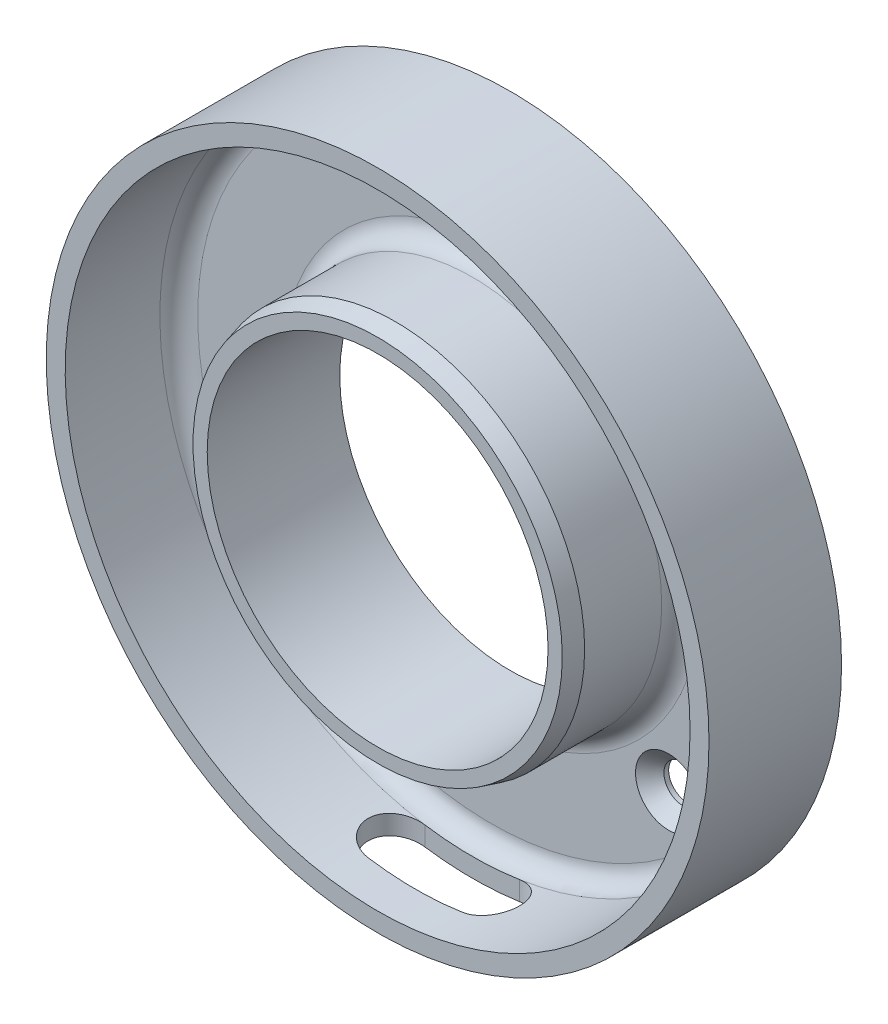
ISO-10303-21;
HEADER;
FILE_DESCRIPTION(('STEP AP214'),'2;1');
FILE_NAME('part.step','',(''),(''),'','','');
FILE_SCHEMA(('AUTOMOTIVE_DESIGN { 1 0 10303 214 1 1 1 1 }'));
ENDSEC;
DATA;
#1=APPLICATION_CONTEXT('core data for automotive mechanical design processes');
#2=APPLICATION_PROTOCOL_DEFINITION('international standard','automotive_design',2000,#1);
#3=PRODUCT_CONTEXT('',#1,'mechanical');
#4=PRODUCT('Part','Part','',(#3));
#5=PRODUCT_RELATED_PRODUCT_CATEGORY('part','',(#4));
#6=PRODUCT_DEFINITION_FORMATION('','',#4);
#7=PRODUCT_DEFINITION_CONTEXT('part definition',#1,'design');
#8=PRODUCT_DEFINITION('design','',#6,#7);
#9=PRODUCT_DEFINITION_SHAPE('','',#8);
#10=(LENGTH_UNIT() NAMED_UNIT(*) SI_UNIT(.MILLI.,.METRE.));
#11=(NAMED_UNIT(*) PLANE_ANGLE_UNIT() SI_UNIT($,.RADIAN.));
#12=(NAMED_UNIT(*) SI_UNIT($,.STERADIAN.) SOLID_ANGLE_UNIT());
#13=UNCERTAINTY_MEASURE_WITH_UNIT(LENGTH_MEASURE(1.E-05),#10,'distance_accuracy_value','');
#14=(GEOMETRIC_REPRESENTATION_CONTEXT(3) GLOBAL_UNCERTAINTY_ASSIGNED_CONTEXT((#13)) GLOBAL_UNIT_ASSIGNED_CONTEXT((#10,
#11,#12)) REPRESENTATION_CONTEXT('',''));
#15=CARTESIAN_POINT('',(0.,0.,0.));
#16=DIRECTION('',(0.,0.,1.));
#17=DIRECTION('',(1.,0.,0.));
#18=AXIS2_PLACEMENT_3D('',#15,#16,#17);
#19=CARTESIAN_POINT('',(0.,0.,14.));
#20=DIRECTION('',(0.,0.,1.));
#21=DIRECTION('',(1.,0.,0.));
#22=AXIS2_PLACEMENT_3D('',#19,#20,#21);
#23=PLANE('',#22);
#24=CARTESIAN_POINT('',(0.,0.,14.));
#25=DIRECTION('',(0.,0.,1.));
#26=DIRECTION('',(1.,0.,0.));
#27=AXIS2_PLACEMENT_3D('',#24,#25,#26);
#28=CIRCLE('',#27,19.5);
#29=CARTESIAN_POINT('',(19.5,0.,14.));
#30=VERTEX_POINT('',#29);
#31=EDGE_CURVE('E41',#30,#30,#28,.T.);
#32=ORIENTED_EDGE('',*,*,#31,.T.);
#33=EDGE_LOOP('',(#32));
#34=FACE_BOUND('',#33,.T.);
#35=CARTESIAN_POINT('',(0.,0.,14.));
#36=DIRECTION('',(0.,0.,1.));
#37=DIRECTION('',(1.,0.,0.));
#38=AXIS2_PLACEMENT_3D('',#35,#36,#37);
#39=CIRCLE('',#38,18.);
#40=CARTESIAN_POINT('',(18.,0.,14.));
#41=VERTEX_POINT('',#40);
#42=EDGE_CURVE('E303',#41,#41,#39,.T.);
#43=ORIENTED_EDGE('',*,*,#42,.F.);
#44=EDGE_LOOP('',(#43));
#45=FACE_BOUND('',#44,.T.);
#46=ADVANCED_FACE('F33',(#34,#45),#23,.T.);
#47=CARTESIAN_POINT('',(0.,0.,14.));
#48=DIRECTION('',(0.,0.,-1.));
#49=DIRECTION('',(-1.,0.,0.));
#50=AXIS2_PLACEMENT_3D('',#47,#48,#49);
#51=CYLINDRICAL_SURFACE('',#50,35.);
#52=CARTESIAN_POINT('',(-5.,-34.6410161513776,4.));
#53=CARTESIAN_POINT('',(-5.08552983660781,-34.6286741180472,3.99999232107327));
#54=CARTESIAN_POINT('',(-5.17100720663486,-34.6160100937747,4.00365760441739));
#55=CARTESIAN_POINT('',(-5.34125080407917,-34.5901488194821,4.01824974552053));
#56=CARTESIAN_POINT('',(-5.42601709726176,-34.5769516194454,4.02917592407328));
#57=CARTESIAN_POINT('',(-5.59418606042166,-34.5501423628034,4.05819475155788));
#58=CARTESIAN_POINT('',(-5.67758969671915,-34.5365306217022,4.07628207009953));
#59=CARTESIAN_POINT('',(-5.84248929187043,-34.5090179683182,4.11946432857444));
#60=CARTESIAN_POINT('',(-5.92398524564424,-34.4951170552656,4.14455928716612));
#61=CARTESIAN_POINT('',(-6.16480132889005,-34.4531806222849,4.23012638405849));
#62=CARTESIAN_POINT('',(-6.32055894059739,-34.4248938764362,4.30089972848106));
#63=CARTESIAN_POINT('',(-6.61780909883044,-34.3689912628606,4.46784867583562));
#64=CARTESIAN_POINT('',(-6.75930307970359,-34.3413753278894,4.56402172105168));
#65=CARTESIAN_POINT('',(-7.02448652539232,-34.288116468765,4.77948428739878));
#66=CARTESIAN_POINT('',(-7.14813300530283,-34.2624783750169,4.89882804634267));
#67=CARTESIAN_POINT('',(-7.37355290099156,-34.2146757601151,5.15727076763862));
#68=CARTESIAN_POINT('',(-7.47532507548347,-34.1925114361044,5.29637085034584));
#69=CARTESIAN_POINT('',(-7.65264057717463,-34.1532613360815,5.58850901656804));
#70=CARTESIAN_POINT('',(-7.72851108576975,-34.136112634544,5.74133985839494));
#71=CARTESIAN_POINT('',(-7.853384158209,-34.1076016596265,6.05810441855108));
#72=CARTESIAN_POINT('',(-7.90239238011742,-34.0962381677306,6.22203579057101));
#73=CARTESIAN_POINT('',(-7.97106578840376,-34.080248438695,6.55219703013407));
#74=CARTESIAN_POINT('',(-7.99139662382684,-34.0754694283428,6.71828118319439));
#75=CARTESIAN_POINT('',(-8.00418785175352,-34.0724672782652,7.05157365129391));
#76=CARTESIAN_POINT('',(-7.99665053965215,-34.0742435986018,7.21878187261546));
#77=CARTESIAN_POINT('',(-7.95427353884131,-34.0841602970762,7.54705631147333));
#78=CARTESIAN_POINT('',(-7.9198259614072,-34.0922092719164,7.70817617446399));
#79=CARTESIAN_POINT('',(-7.82522215842988,-34.1140474773401,8.02226368318522));
#80=CARTESIAN_POINT('',(-7.76506521948651,-34.1278368672122,8.17523110256397));
#81=CARTESIAN_POINT('',(-7.62032515732691,-34.1604473612357,8.4700613590119));
#82=CARTESIAN_POINT('',(-7.53555222198686,-34.1793074782977,8.61182657766984));
#83=CARTESIAN_POINT('',(-7.34428078798582,-34.220915983508,8.87919473359257));
#84=CARTESIAN_POINT('',(-7.23778086568783,-34.2436646264316,9.00479661089221));
#85=CARTESIAN_POINT('',(-7.00340731002443,-34.2923738138387,9.23929769189263));
#86=CARTESIAN_POINT('',(-6.87510667280867,-34.31839511105,9.34775748474168));
#87=CARTESIAN_POINT('',(-6.60238733421846,-34.3719037328589,9.5417246385616));
#88=CARTESIAN_POINT('',(-6.45796169398025,-34.3993916859065,9.62722206412283));
#89=CARTESIAN_POINT('',(-6.15406732177771,-34.4550688267875,9.7743809643749));
#90=CARTESIAN_POINT('',(-5.99436378459923,-34.4832613740871,9.83555549804539));
#91=CARTESIAN_POINT('',(-5.66685808908223,-34.538589548491,9.92988829311847));
#92=CARTESIAN_POINT('',(-5.49906875058232,-34.5657267329133,9.96308945474826));
#93=CARTESIAN_POINT('',(-5.27498719812142,-34.6002546459527,9.98788122555558));
#94=CARTESIAN_POINT('',(-5.22006585037706,-34.6085830624529,9.99242651462529));
#95=CARTESIAN_POINT('',(-5.11011018567253,-34.6249887298404,9.99848191580185));
#96=CARTESIAN_POINT('',(-5.05507619737736,-34.6330663669283,9.99999694872525));
#97=CARTESIAN_POINT('',(-5.,-34.6410161513776,10.));
#98=B_SPLINE_CURVE_WITH_KNOTS('',3,(#52,#53,#54,#55,#56,#57,#58,#59,#60,#61,#62,#63,#64,#65,#66,
#67,#68,#69,#70,#71,#72,#73,#74,#75,#76,#77,#78,#79,#80,#81,#82,#83,#84,#85,#86,#87,#88,#89,#90,
#91,#92,#93,#94,#95,#96,#97),.UNSPECIFIED.,.F.,.F.,(4,2,2,2,2,2,2,2,2,2,2,2,2,2,2,2,2,2,2,2,2,2,
4),(0.,0.259158900700492,0.518293562299219,0.777235698716151,1.03617852459403,1.55373157397357,
2.071232526311,2.58995977228071,3.10871644634519,3.62065431684983,4.13248431524317,
4.63222662278304,5.13192776933623,5.62448053854274,6.11704697631278,6.61351727186552,
7.11002010854431,7.61769458654408,8.12558837370307,8.64319200270672,9.1600003774872,
9.32714537982392,9.49401873520856),.UNSPECIFIED.);
#99=CARTESIAN_POINT('',(-5.,-34.6410161513775,4.));
#100=VERTEX_POINT('',#99);
#101=CARTESIAN_POINT('',(-5.,-34.6410161513775,10.));
#102=VERTEX_POINT('',#101);
#103=EDGE_CURVE('E232',#100,#102,#98,.T.);
#104=ORIENTED_EDGE('',*,*,#103,.T.);
#105=CARTESIAN_POINT('',(0.,0.,10.));
#106=DIRECTION('',(0.,0.,1.));
#107=DIRECTION('',(1.,0.,0.));
#108=AXIS2_PLACEMENT_3D('',#105,#106,#107);
#109=CIRCLE('',#108,35.);
#110=CARTESIAN_POINT('',(5.,-34.6410161513775,10.));
#111=VERTEX_POINT('',#110);
#112=EDGE_CURVE('E238',#102,#111,#109,.T.);
#113=ORIENTED_EDGE('',*,*,#112,.T.);
#114=CARTESIAN_POINT('',(5.,-34.6410161513776,10.));
#115=CARTESIAN_POINT('',(5.08552983660781,-34.6286741180472,10.0000076789267));
#116=CARTESIAN_POINT('',(5.17100720663486,-34.6160100937747,9.99634239558261));
#117=CARTESIAN_POINT('',(5.34125080407917,-34.5901488194821,9.98175025447947));
#118=CARTESIAN_POINT('',(5.42601709726177,-34.5769516194454,9.97082407592672));
#119=CARTESIAN_POINT('',(5.59418606042166,-34.5501423628034,9.94180524844212));
#120=CARTESIAN_POINT('',(5.67758969671915,-34.5365306217022,9.92371792990047));
#121=CARTESIAN_POINT('',(5.84248929187043,-34.5090179683182,9.88053567142556));
#122=CARTESIAN_POINT('',(5.92398524564424,-34.4951170552656,9.85544071283388));
#123=CARTESIAN_POINT('',(6.16480132889005,-34.4531806222849,9.76987361594151));
#124=CARTESIAN_POINT('',(6.32055894059739,-34.4248938764362,9.69910027151894));
#125=CARTESIAN_POINT('',(6.61780909883044,-34.3689912628606,9.53215132416438));
#126=CARTESIAN_POINT('',(6.75930307970359,-34.3413753278894,9.43597827894832));
#127=CARTESIAN_POINT('',(7.02448652539232,-34.288116468765,9.22051571260122));
#128=CARTESIAN_POINT('',(7.14813300530283,-34.2624783750169,9.10117195365733));
#129=CARTESIAN_POINT('',(7.37355290099156,-34.2146757601151,8.84272923236138));
#130=CARTESIAN_POINT('',(7.47532507548347,-34.1925114361044,8.70362914965416));
#131=CARTESIAN_POINT('',(7.65264057717463,-34.1532613360815,8.41149098343196));
#132=CARTESIAN_POINT('',(7.72851108576975,-34.136112634544,8.25866014160506));
#133=CARTESIAN_POINT('',(7.853384158209,-34.1076016596265,7.94189558144892));
#134=CARTESIAN_POINT('',(7.90239238011742,-34.0962381677306,7.77796420942898));
#135=CARTESIAN_POINT('',(7.97106578840376,-34.080248438695,7.44780296986593));
#136=CARTESIAN_POINT('',(7.99139662382684,-34.0754694283428,7.28171881680561));
#137=CARTESIAN_POINT('',(8.00418785175352,-34.0724672782652,6.94842634870609));
#138=CARTESIAN_POINT('',(7.99665053965215,-34.0742435986018,6.78121812738454));
#139=CARTESIAN_POINT('',(7.95427353884131,-34.0841602970762,6.45294368852667));
#140=CARTESIAN_POINT('',(7.91982596140721,-34.0922092719164,6.29182382553601));
#141=CARTESIAN_POINT('',(7.82522215842989,-34.1140474773401,5.97773631681478));
#142=CARTESIAN_POINT('',(7.76506521948651,-34.1278368672122,5.82476889743603));
#143=CARTESIAN_POINT('',(7.62032515732691,-34.1604473612357,5.5299386409881));
#144=CARTESIAN_POINT('',(7.53555222198686,-34.1793074782977,5.38817342233016));
#145=CARTESIAN_POINT('',(7.34428078798582,-34.220915983508,5.12080526640743));
#146=CARTESIAN_POINT('',(7.23778086568783,-34.2436646264316,4.99520338910779));
#147=CARTESIAN_POINT('',(7.00340731002443,-34.2923738138387,4.76070230810737));
#148=CARTESIAN_POINT('',(6.87510667280867,-34.31839511105,4.65224251525832));
#149=CARTESIAN_POINT('',(6.60238733421846,-34.3719037328589,4.4582753614384));
#150=CARTESIAN_POINT('',(6.45796169398025,-34.3993916859065,4.37277793587716));
#151=CARTESIAN_POINT('',(6.15406732177771,-34.4550688267875,4.2256190356251));
#152=CARTESIAN_POINT('',(5.99436378459923,-34.4832613740871,4.1644445019546));
#153=CARTESIAN_POINT('',(5.66685808908223,-34.538589548491,4.07011170688153));
#154=CARTESIAN_POINT('',(5.49906875058232,-34.5657267329133,4.03691054525174));
#155=CARTESIAN_POINT('',(5.27498719812142,-34.6002546459527,4.01211877444442));
#156=CARTESIAN_POINT('',(5.22006585037706,-34.6085830624529,4.00757348537471));
#157=CARTESIAN_POINT('',(5.11011018567253,-34.6249887298404,4.00151808419815));
#158=CARTESIAN_POINT('',(5.05507619737736,-34.6330663669283,4.00000305127475));
#159=CARTESIAN_POINT('',(5.,-34.6410161513776,4.));
#160=B_SPLINE_CURVE_WITH_KNOTS('',3,(#114,#115,#116,#117,#118,#119,#120,#121,#122,#123,#124,
#125,#126,#127,#128,#129,#130,#131,#132,#133,#134,#135,#136,#137,#138,#139,#140,#141,#142,#143,
#144,#145,#146,#147,#148,#149,#150,#151,#152,#153,#154,#155,#156,#157,#158,#159),.UNSPECIFIED.,
.F.,.F.,(4,2,2,2,2,2,2,2,2,2,2,2,2,2,2,2,2,2,2,2,2,2,4),(0.,0.259158900700492,0.518293562299219,
0.777235698716151,1.03617852459403,1.55373157397357,2.071232526311,2.58995977228071,
3.10871644634519,3.62065431684983,4.13248431524317,4.63222662278304,5.13192776933623,
5.62448053854274,6.11704697631278,6.61351727186552,7.11002010854431,7.61769458654408,
8.12558837370307,8.64319200270672,9.1600003774872,9.32714537982392,9.49401873520857),.UNSPECIFIED.);
#161=CARTESIAN_POINT('',(5.,-34.6410161513776,4.));
#162=VERTEX_POINT('',#161);
#163=EDGE_CURVE('E198',#111,#162,#160,.T.);
#164=ORIENTED_EDGE('',*,*,#163,.T.);
#165=CARTESIAN_POINT('',(0.,0.,4.));
#166=DIRECTION('',(0.,0.,-1.));
#167=DIRECTION('',(-1.,0.,0.));
#168=AXIS2_PLACEMENT_3D('',#165,#166,#167);
#169=CIRCLE('',#168,35.);
#170=EDGE_CURVE('E547',#162,#100,#169,.T.);
#171=ORIENTED_EDGE('',*,*,#170,.T.);
#172=EDGE_LOOP('',(#104,#113,#164,#171));
#173=FACE_BOUND('',#172,.T.);
#174=CARTESIAN_POINT('',(0.,0.,14.));
#175=DIRECTION('',(0.,0.,1.));
#176=DIRECTION('',(1.,0.,0.));
#177=AXIS2_PLACEMENT_3D('',#174,#175,#176);
#178=CIRCLE('',#177,35.);
#179=CARTESIAN_POINT('',(35.,0.,14.));
#180=VERTEX_POINT('',#179);
#181=EDGE_CURVE('E291',#180,#180,#178,.T.);
#182=ORIENTED_EDGE('',*,*,#181,.F.);
#183=EDGE_LOOP('',(#182));
#184=FACE_BOUND('',#183,.T.);
#185=CARTESIAN_POINT('',(0.,0.,0.));
#186=DIRECTION('',(0.,0.,1.));
#187=DIRECTION('',(1.,0.,0.));
#188=AXIS2_PLACEMENT_3D('',#185,#186,#187);
#189=CIRCLE('',#188,35.);
#190=CARTESIAN_POINT('',(35.,0.,0.));
#191=VERTEX_POINT('',#190);
#192=EDGE_CURVE('E294',#191,#191,#189,.T.);
#193=ORIENTED_EDGE('',*,*,#192,.T.);
#194=EDGE_LOOP('',(#193));
#195=FACE_BOUND('',#194,.T.);
#196=ADVANCED_FACE('F240',(#173,#184,#195),#51,.T.);
#197=CARTESIAN_POINT('',(0.,0.,14.));
#198=DIRECTION('',(0.,0.,1.));
#199=DIRECTION('',(1.,0.,0.));
#200=AXIS2_PLACEMENT_3D('',#197,#198,#199);
#201=CIRCLE('',#200,33.);
#202=CARTESIAN_POINT('',(33.,0.,14.));
#203=VERTEX_POINT('',#202);
#204=EDGE_CURVE('E288',#203,#203,#201,.T.);
#205=ORIENTED_EDGE('',*,*,#204,.F.);
#206=EDGE_LOOP('',(#205));
#207=FACE_BOUND('',#206,.T.);
#208=ORIENTED_EDGE('',*,*,#181,.T.);
#209=EDGE_LOOP('',(#208));
#210=FACE_BOUND('',#209,.T.);
#211=ADVANCED_FACE('F245',(#207,#210),#23,.T.);
#212=CARTESIAN_POINT('',(0.,0.,0.));
#213=DIRECTION('',(0.,0.,1.));
#214=DIRECTION('',(1.,0.,0.));
#215=AXIS2_PLACEMENT_3D('',#212,#213,#214);
#216=PLANE('',#215);
#217=CARTESIAN_POINT('',(18.7383297014435,-18.7383297014435,0.));
#218=DIRECTION('',(0.,0.,1.));
#219=DIRECTION('',(1.,0.,0.));
#220=AXIS2_PLACEMENT_3D('',#217,#218,#219);
#221=CIRCLE('',#220,2.);
#222=CARTESIAN_POINT('',(20.7383297014436,-18.7383297014435,0.));
#223=VERTEX_POINT('',#222);
#224=EDGE_CURVE('E338',#223,#223,#221,.T.);
#225=ORIENTED_EDGE('',*,*,#224,.T.);
#226=EDGE_LOOP('',(#225));
#227=FACE_BOUND('',#226,.T.);
#228=CARTESIAN_POINT('',(-18.7383297014435,-18.7383297014435,0.));
#229=DIRECTION('',(0.,0.,1.));
#230=DIRECTION('',(1.,0.,0.));
#231=AXIS2_PLACEMENT_3D('',#228,#229,#230);
#232=CIRCLE('',#231,2.);
#233=CARTESIAN_POINT('',(-16.7383297014435,-18.7383297014435,0.));
#234=VERTEX_POINT('',#233);
#235=EDGE_CURVE('E141',#234,#234,#232,.T.);
#236=ORIENTED_EDGE('',*,*,#235,.T.);
#237=EDGE_LOOP('',(#236));
#238=FACE_BOUND('',#237,.T.);
#239=DIRECTION('',(0.87681240867132,-0.480832611206851,0.));
#240=VECTOR('',#239,1.);
#241=CARTESIAN_POINT('',(-10.0217776156208,-28.0651460949938,0.));
#242=LINE('',#241,#240);
#243=CARTESIAN_POINT('',(-10.0217776156208,-28.0651460949938,0.));
#244=VERTEX_POINT('',#243);
#245=CARTESIAN_POINT('',(-8.63826259094278,-28.8238478827204,0.));
#246=VERTEX_POINT('',#245);
#247=EDGE_CURVE('E124',#244,#246,#242,.T.);
#248=ORIENTED_EDGE('',*,*,#247,.T.);
#249=DIRECTION('',(0.480832611206851,0.87681240867132,0.));
#250=VECTOR('',#249,1.);
#251=CARTESIAN_POINT('',(-8.63826259094278,-28.8238478827204,0.));
#252=LINE('',#251,#250);
#253=CARTESIAN_POINT('',(-8.11559739232955,-27.8707525205434,0.));
#254=VERTEX_POINT('',#253);
#255=EDGE_CURVE('E118',#246,#254,#252,.T.);
#256=ORIENTED_EDGE('',*,*,#255,.T.);
#257=DIRECTION('',(-0.87681240867132,0.48083261120685,0.));
#258=VECTOR('',#257,1.);
#259=CARTESIAN_POINT('',(-8.11559739232955,-27.8707525205434,0.));
#260=LINE('',#259,#258);
#261=CARTESIAN_POINT('',(-9.49911241700757,-27.1120507328167,0.));
#262=VERTEX_POINT('',#261);
#263=EDGE_CURVE('E127',#254,#262,#260,.T.);
#264=ORIENTED_EDGE('',*,*,#263,.T.);
#265=DIRECTION('',(0.48083261120685,0.87681240867132,0.));
#266=VECTOR('',#265,1.);
#267=CARTESIAN_POINT('',(-9.49911241700757,-27.1120507328167,0.));
#268=LINE('',#267,#266);
#269=CARTESIAN_POINT('',(-9.05906538012611,-26.3096120185035,0.));
#270=VERTEX_POINT('',#269);
#271=EDGE_CURVE('E48',#262,#270,#268,.T.);
#272=ORIENTED_EDGE('',*,*,#271,.T.);
#273=DIRECTION('',(-0.959999999999998,-0.280000000000007,0.));
#274=VECTOR('',#273,1.);
#275=CARTESIAN_POINT('',(-9.05906538012611,-26.3096120185035,0.));
#276=LINE('',#275,#274);
#277=CARTESIAN_POINT('',(-10.9844898511154,-26.8711941558754,0.));
#278=VERTEX_POINT('',#277);
#279=EDGE_CURVE('E145',#270,#278,#276,.T.);
#280=ORIENTED_EDGE('',*,*,#279,.T.);
#281=DIRECTION('',(0.280000000000008,-0.959999999999998,0.));
#282=VECTOR('',#281,1.);
#283=CARTESIAN_POINT('',(-10.9844898511154,-26.8711941558754,0.));
#284=LINE('',#283,#282);
#285=CARTESIAN_POINT('',(-10.4229077137435,-28.7966186268647,0.));
#286=VERTEX_POINT('',#285);
#287=EDGE_CURVE('E148',#278,#286,#284,.T.);
#288=ORIENTED_EDGE('',*,*,#287,.T.);
#289=DIRECTION('',(0.480832611206851,0.87681240867132,0.));
#290=VECTOR('',#289,1.);
#291=CARTESIAN_POINT('',(-10.4229077137435,-28.7966186268647,0.));
#292=LINE('',#291,#290);
#293=EDGE_CURVE('E151',#286,#244,#292,.T.);
#294=ORIENTED_EDGE('',*,*,#293,.T.);
#295=EDGE_LOOP('',(#248,#256,#264,#272,#280,#288,#294));
#296=FACE_BOUND('',#295,.T.);
#297=CARTESIAN_POINT('',(0.,0.,0.));
#298=DIRECTION('',(0.,0.,1.));
#299=DIRECTION('',(1.,0.,0.));
#300=AXIS2_PLACEMENT_3D('',#297,#298,#299);
#301=CIRCLE('',#300,18.);
#302=CARTESIAN_POINT('',(18.,0.,0.));
#303=VERTEX_POINT('',#302);
#304=EDGE_CURVE('E300',#303,#303,#301,.T.);
#305=ORIENTED_EDGE('',*,*,#304,.T.);
#306=EDGE_LOOP('',(#305));
#307=FACE_BOUND('',#306,.T.);
#308=ORIENTED_EDGE('',*,*,#192,.F.);
#309=EDGE_LOOP('',(#308));
#310=FACE_BOUND('',#309,.T.);
#311=ADVANCED_FACE('F131',(#227,#238,#296,#307,#310),#216,.F.);
#312=CARTESIAN_POINT('',(0.,0.,0.));
#313=DIRECTION('',(0.,0.,1.));
#314=DIRECTION('',(1.,0.,0.));
#315=AXIS2_PLACEMENT_3D('',#312,#313,#314);
#316=CYLINDRICAL_SURFACE('',#315,18.);
#317=ORIENTED_EDGE('',*,*,#304,.F.);
#318=EDGE_LOOP('',(#317));
#319=FACE_BOUND('',#318,.T.);
#320=ORIENTED_EDGE('',*,*,#42,.T.);
#321=EDGE_LOOP('',(#320));
#322=FACE_BOUND('',#321,.T.);
#323=ADVANCED_FACE('F283',(#319,#322),#316,.F.);
#324=CARTESIAN_POINT('',(0.,0.,14.));
#325=DIRECTION('',(0.,0.,-1.));
#326=DIRECTION('',(-1.,0.,0.));
#327=AXIS2_PLACEMENT_3D('',#324,#325,#326);
#328=CYLINDRICAL_SURFACE('',#327,33.);
#329=CARTESIAN_POINT('',(-5.,-32.6190128606002,4.));
#330=CARTESIAN_POINT('',(-5.08567690139751,-32.6058832395547,3.99999237528512));
#331=CARTESIAN_POINT('',(-5.17129493046452,-32.5924105318184,4.00367018768212));
#332=CARTESIAN_POINT('',(-5.34180571849769,-32.5648969229584,4.01830942706952));
#333=CARTESIAN_POINT('',(-5.42669854878898,-32.5508560785102,4.02927012921751));
#334=CARTESIAN_POINT('',(-5.59510551819629,-32.5223322187627,4.05837700066102));
#335=CARTESIAN_POINT('',(-5.67862064371933,-32.5078495430418,4.07651777388004));
#336=CARTESIAN_POINT('',(-5.8437294126661,-32.4785755715802,4.11982387074445));
#337=CARTESIAN_POINT('',(-5.92532304726628,-32.463784274423,4.14498922664013));
#338=CARTESIAN_POINT('',(-6.16640770627963,-32.4191610961814,4.23078888779681));
#339=CARTESIAN_POINT('',(-6.32231688599139,-32.3890604245839,4.30174670099685));
#340=CARTESIAN_POINT('',(-6.61982970230019,-32.3295678192719,4.46912589122894));
#341=CARTESIAN_POINT('',(-6.76143458480437,-32.3001758240016,4.56554504792442));
#342=CARTESIAN_POINT('',(-7.02684282742583,-32.2434792180173,4.78161126757835));
#343=CARTESIAN_POINT('',(-7.15059704098062,-32.2161804635767,4.90132040432469));
#344=CARTESIAN_POINT('',(-7.37615660565473,-32.1652875881575,5.16059612489731));
#345=CARTESIAN_POINT('',(-7.47796099062424,-32.1416936302628,5.30016358236436));
#346=CARTESIAN_POINT('',(-7.65507682434171,-32.099968610007,5.59308097097063));
#347=CARTESIAN_POINT('',(-7.73075874854703,-32.0817617269836,5.74619583224136));
#348=CARTESIAN_POINT('',(-7.85519192168872,-32.0515224690244,6.06356328694236));
#349=CARTESIAN_POINT('',(-7.90394941301023,-32.0394886629171,6.22781328878514));
#350=CARTESIAN_POINT('',(-7.97193223078705,-32.0226404182595,6.5580881073468));
#351=CARTESIAN_POINT('',(-7.99191063743346,-32.0176419649813,6.72394870655124));
#352=CARTESIAN_POINT('',(-8.00408005061087,-32.0146021156184,7.05674404271077));
#353=CARTESIAN_POINT('',(-7.99627369344336,-32.0165600594898,7.22367867625804));
#354=CARTESIAN_POINT('',(-7.95349824087013,-32.02721228355,7.55106053756265));
#355=CARTESIAN_POINT('',(-7.91896734310864,-32.035797885424,7.71156889464765));
#356=CARTESIAN_POINT('',(-7.82440693813612,-32.0590237952905,8.02441839383624));
#357=CARTESIAN_POINT('',(-7.76437660457705,-32.073664299501,8.17675927108001));
#358=CARTESIAN_POINT('',(-7.6200330925332,-32.1082641401102,8.47052885782842));
#359=CARTESIAN_POINT('',(-7.53550492106259,-32.1282704454995,8.61184624678818));
#360=CARTESIAN_POINT('',(-7.34489919336011,-32.1723794222814,8.87837662305264));
#361=CARTESIAN_POINT('',(-7.23881993881185,-32.1964824164859,9.00358833989155));
#362=CARTESIAN_POINT('',(-7.00511851424645,-32.2481467223887,9.23775621216434));
#363=CARTESIAN_POINT('',(-6.87701734930228,-32.2757803586602,9.34621835452407));
#364=CARTESIAN_POINT('',(-6.60473275026274,-32.3325969172647,9.54023396265103));
#365=CARTESIAN_POINT('',(-6.46054216544101,-32.361780525418,9.62577718450851));
#366=CARTESIAN_POINT('',(-6.15677286134179,-32.4209592444613,9.77326676660351));
#367=CARTESIAN_POINT('',(-5.99693033771363,-32.4509583312182,9.8346674041709));
#368=CARTESIAN_POINT('',(-5.66908176779511,-32.5098310876402,9.92939400146069));
#369=CARTESIAN_POINT('',(-5.50108865135776,-32.5387064167889,9.96276298273711));
#370=CARTESIAN_POINT('',(-5.27648048957056,-32.5754801539773,9.98774885768789));
#371=CARTESIAN_POINT('',(-5.2212655132842,-32.5843756705675,9.99234356848807));
#372=CARTESIAN_POINT('',(-5.11071515190095,-32.6018972370676,9.99846513105348));
#373=CARTESIAN_POINT('',(-5.05538010706077,-32.6105237003999,9.99999694363179));
#374=CARTESIAN_POINT('',(-5.,-32.6190128606002,10.));
#375=B_SPLINE_CURVE_WITH_KNOTS('',3,(#329,#330,#331,#332,#333,#334,#335,#336,#337,#338,#339,
#340,#341,#342,#343,#344,#345,#346,#347,#348,#349,#350,#351,#352,#353,#354,#355,#356,#357,#358,
#359,#360,#361,#362,#363,#364,#365,#366,#367,#368,#369,#370,#371,#372,#373,#374),.UNSPECIFIED.,
.F.,.F.,(4,2,2,2,2,2,2,2,2,2,2,2,2,2,2,2,2,2,2,2,2,2,4),(0.,0.259942194399603,0.519858521469709,
0.779579882034556,1.03930243501616,1.55839872460256,2.07744976174289,2.59790363875642,
3.11838041953917,3.63113908532538,4.14377881889783,4.64274382360891,5.14166148629022,
5.63256742993196,6.12348928334227,6.61885715147577,7.11426407184303,7.62226177990405,
8.13048616678906,8.64961590581631,9.16794744783041,9.33623280844616,9.50424538473006),.UNSPECIFIED.);
#376=CARTESIAN_POINT('',(-5.,-32.6190128606002,4.));
#377=VERTEX_POINT('',#376);
#378=CARTESIAN_POINT('',(-5.,-32.6190128606002,10.));
#379=VERTEX_POINT('',#378);
#380=EDGE_CURVE('E227',#377,#379,#375,.T.);
#381=ORIENTED_EDGE('',*,*,#380,.F.);
#382=CARTESIAN_POINT('',(0.,0.,4.));
#383=DIRECTION('',(0.,0.,1.));
#384=DIRECTION('',(1.,0.,0.));
#385=AXIS2_PLACEMENT_3D('',#382,#383,#384);
#386=CIRCLE('',#385,33.);
#387=CARTESIAN_POINT('',(5.,-32.6190128606002,4.));
#388=VERTEX_POINT('',#387);
#389=EDGE_CURVE('E311',#377,#388,#386,.F.);
#390=ORIENTED_EDGE('',*,*,#389,.T.);
#391=CARTESIAN_POINT('',(5.,-32.6190128606002,10.));
#392=CARTESIAN_POINT('',(5.08567690139752,-32.6058832395547,10.0000076247149));
#393=CARTESIAN_POINT('',(5.17129493046452,-32.5924105318184,9.99632981231787));
#394=CARTESIAN_POINT('',(5.34180571849769,-32.5648969229584,9.98169057293048));
#395=CARTESIAN_POINT('',(5.42669854878898,-32.5508560785102,9.97072987078249));
#396=CARTESIAN_POINT('',(5.59510551819629,-32.5223322187627,9.94162299933898));
#397=CARTESIAN_POINT('',(5.67862064371933,-32.5078495430418,9.92348222611996));
#398=CARTESIAN_POINT('',(5.8437294126661,-32.4785755715802,9.88017612925555));
#399=CARTESIAN_POINT('',(5.92532304726628,-32.463784274423,9.85501077335987));
#400=CARTESIAN_POINT('',(6.16640770627963,-32.4191610961814,9.76921111220319));
#401=CARTESIAN_POINT('',(6.32231688599139,-32.3890604245839,9.69825329900314));
#402=CARTESIAN_POINT('',(6.61982970230019,-32.3295678192719,9.53087410877106));
#403=CARTESIAN_POINT('',(6.76143458480437,-32.3001758240016,9.43445495207558));
#404=CARTESIAN_POINT('',(7.02684282742583,-32.2434792180173,9.21838873242165));
#405=CARTESIAN_POINT('',(7.15059704098062,-32.2161804635767,9.0986795956753));
#406=CARTESIAN_POINT('',(7.37615660565473,-32.1652875881575,8.83940387510269));
#407=CARTESIAN_POINT('',(7.47796099062424,-32.1416936302628,8.69983641763564));
#408=CARTESIAN_POINT('',(7.65507682434171,-32.099968610007,8.40691902902937));
#409=CARTESIAN_POINT('',(7.73075874854703,-32.0817617269836,8.25380416775863));
#410=CARTESIAN_POINT('',(7.85519192168872,-32.0515224690244,7.93643671305763));
#411=CARTESIAN_POINT('',(7.90394941301023,-32.0394886629171,7.77218671121485));
#412=CARTESIAN_POINT('',(7.97193223078706,-32.0226404182595,7.44191189265319));
#413=CARTESIAN_POINT('',(7.99191063743346,-32.0176419649813,7.27605129344875));
#414=CARTESIAN_POINT('',(8.00408005061087,-32.0146021156184,6.94325595728923));
#415=CARTESIAN_POINT('',(7.99627369344336,-32.0165600594898,6.77632132374196));
#416=CARTESIAN_POINT('',(7.95349824087013,-32.02721228355,6.44893946243735));
#417=CARTESIAN_POINT('',(7.91896734310864,-32.035797885424,6.28843110535235));
#418=CARTESIAN_POINT('',(7.82440693813612,-32.0590237952905,5.97558160616375));
#419=CARTESIAN_POINT('',(7.76437660457705,-32.073664299501,5.82324072891999));
#420=CARTESIAN_POINT('',(7.6200330925332,-32.1082641401101,5.52947114217158));
#421=CARTESIAN_POINT('',(7.53550492106259,-32.1282704454995,5.38815375321182));
#422=CARTESIAN_POINT('',(7.34489919336011,-32.1723794222814,5.12162337694736));
#423=CARTESIAN_POINT('',(7.23881993881185,-32.1964824164859,4.99641166010845));
#424=CARTESIAN_POINT('',(7.00511851424645,-32.2481467223887,4.76224378783566));
#425=CARTESIAN_POINT('',(6.87701734930228,-32.2757803586602,4.65378164547593));
#426=CARTESIAN_POINT('',(6.60473275026274,-32.3325969172647,4.45976603734897));
#427=CARTESIAN_POINT('',(6.46054216544101,-32.361780525418,4.37422281549149));
#428=CARTESIAN_POINT('',(6.15677286134179,-32.4209592444613,4.22673323339649));
#429=CARTESIAN_POINT('',(5.99693033771363,-32.4509583312182,4.16533259582909));
#430=CARTESIAN_POINT('',(5.66908176779511,-32.5098310876402,4.07060599853931));
#431=CARTESIAN_POINT('',(5.50108865135776,-32.5387064167889,4.03723701726289));
#432=CARTESIAN_POINT('',(5.27648048957056,-32.5754801539773,4.01225114231211));
#433=CARTESIAN_POINT('',(5.2212655132842,-32.5843756705675,4.00765643151193));
#434=CARTESIAN_POINT('',(5.11071515190095,-32.6018972370676,4.00153486894652));
#435=CARTESIAN_POINT('',(5.05538010706077,-32.6105237003999,4.00000305636821));
#436=CARTESIAN_POINT('',(5.,-32.6190128606002,4.));
#437=B_SPLINE_CURVE_WITH_KNOTS('',3,(#391,#392,#393,#394,#395,#396,#397,#398,#399,#400,#401,
#402,#403,#404,#405,#406,#407,#408,#409,#410,#411,#412,#413,#414,#415,#416,#417,#418,#419,#420,
#421,#422,#423,#424,#425,#426,#427,#428,#429,#430,#431,#432,#433,#434,#435,#436),.UNSPECIFIED.,
.F.,.F.,(4,2,2,2,2,2,2,2,2,2,2,2,2,2,2,2,2,2,2,2,2,2,4),(0.,0.259942194399603,0.519858521469709,
0.779579882034556,1.03930243501616,1.55839872460256,2.07744976174289,2.59790363875642,
3.11838041953917,3.63113908532539,4.14377881889783,4.64274382360891,5.14166148629022,
5.63256742993197,6.12348928334227,6.61885715147578,7.11426407184303,7.62226177990406,
8.13048616678906,8.64961590581631,9.16794744783041,9.33623280844616,9.50424538473006),.UNSPECIFIED.);
#438=CARTESIAN_POINT('',(5.,-32.6190128606002,10.));
#439=VERTEX_POINT('',#438);
#440=EDGE_CURVE('E183',#439,#388,#437,.T.);
#441=ORIENTED_EDGE('',*,*,#440,.F.);
#442=CARTESIAN_POINT('',(0.,0.,10.));
#443=DIRECTION('',(0.,0.,1.));
#444=DIRECTION('',(1.,0.,0.));
#445=AXIS2_PLACEMENT_3D('',#442,#443,#444);
#446=CIRCLE('',#445,33.);
#447=EDGE_CURVE('E314',#379,#439,#446,.T.);
#448=ORIENTED_EDGE('',*,*,#447,.F.);
#449=EDGE_LOOP('',(#381,#390,#441,#448));
#450=FACE_BOUND('',#449,.T.);
#451=ORIENTED_EDGE('',*,*,#204,.T.);
#452=EDGE_LOOP('',(#451));
#453=FACE_BOUND('',#452,.T.);
#454=ADVANCED_FACE('F204',(#450,#453),#328,.F.);
#455=CARTESIAN_POINT('',(0.,0.,2.));
#456=DIRECTION('',(0.,0.,1.));
#457=DIRECTION('',(1.,0.,0.));
#458=AXIS2_PLACEMENT_3D('',#455,#456,#457);
#459=PLANE('',#458);
#460=CARTESIAN_POINT('',(18.7383297014435,-18.7383297014435,2.));
#461=DIRECTION('',(0.,0.,1.));
#462=DIRECTION('',(1.,0.,0.));
#463=AXIS2_PLACEMENT_3D('',#460,#461,#462);
#464=CIRCLE('',#463,3.5);
#465=CARTESIAN_POINT('',(22.2383297014436,-18.7383297014435,2.));
#466=VERTEX_POINT('',#465);
#467=EDGE_CURVE('E322',#466,#466,#464,.F.);
#468=ORIENTED_EDGE('',*,*,#467,.T.);
#469=EDGE_LOOP('',(#468));
#470=FACE_BOUND('',#469,.T.);
#471=CARTESIAN_POINT('',(-18.7383297014435,-18.7383297014435,2.));
#472=DIRECTION('',(0.,0.,1.));
#473=DIRECTION('',(1.,0.,0.));
#474=AXIS2_PLACEMENT_3D('',#471,#472,#473);
#475=CIRCLE('',#474,3.49999999999996);
#476=CARTESIAN_POINT('',(-15.2383297014436,-18.7383297014435,2.));
#477=VERTEX_POINT('',#476);
#478=EDGE_CURVE('E319',#477,#477,#475,.F.);
#479=ORIENTED_EDGE('',*,*,#478,.T.);
#480=EDGE_LOOP('',(#479));
#481=FACE_BOUND('',#480,.T.);
#482=DIRECTION('',(0.480832611206851,0.87681240867132,0.));
#483=VECTOR('',#482,1.);
#484=CARTESIAN_POINT('',(-8.63826259094278,-28.8238478827204,2.));
#485=LINE('',#484,#483);
#486=CARTESIAN_POINT('',(-8.63826259094278,-28.8238478827204,2.));
#487=VERTEX_POINT('',#486);
#488=CARTESIAN_POINT('',(-8.11559739232955,-27.8707525205434,2.));
#489=VERTEX_POINT('',#488);
#490=EDGE_CURVE('E56',#487,#489,#485,.T.);
#491=ORIENTED_EDGE('',*,*,#490,.F.);
#492=DIRECTION('',(0.87681240867132,-0.480832611206851,0.));
#493=VECTOR('',#492,1.);
#494=CARTESIAN_POINT('',(-10.0217776156208,-28.0651460949938,2.));
#495=LINE('',#494,#493);
#496=CARTESIAN_POINT('',(-10.0217776156208,-28.0651460949938,2.));
#497=VERTEX_POINT('',#496);
#498=EDGE_CURVE('E135',#497,#487,#495,.T.);
#499=ORIENTED_EDGE('',*,*,#498,.F.);
#500=DIRECTION('',(0.480832611206851,0.87681240867132,0.));
#501=VECTOR('',#500,1.);
#502=CARTESIAN_POINT('',(-10.4229077137435,-28.7966186268647,2.));
#503=LINE('',#502,#501);
#504=CARTESIAN_POINT('',(-10.4229077137435,-28.7966186268647,2.));
#505=VERTEX_POINT('',#504);
#506=EDGE_CURVE('E138',#505,#497,#503,.T.);
#507=ORIENTED_EDGE('',*,*,#506,.F.);
#508=DIRECTION('',(0.280000000000008,-0.959999999999998,0.));
#509=VECTOR('',#508,1.);
#510=CARTESIAN_POINT('',(-10.9844898511154,-26.8711941558754,2.));
#511=LINE('',#510,#509);
#512=CARTESIAN_POINT('',(-10.9844898511154,-26.8711941558754,2.));
#513=VERTEX_POINT('',#512);
#514=EDGE_CURVE('E163',#513,#505,#511,.T.);
#515=ORIENTED_EDGE('',*,*,#514,.F.);
#516=DIRECTION('',(-0.959999999999998,-0.280000000000007,0.));
#517=VECTOR('',#516,1.);
#518=CARTESIAN_POINT('',(-9.05906538012611,-26.3096120185035,2.));
#519=LINE('',#518,#517);
#520=CARTESIAN_POINT('',(-9.05906538012611,-26.3096120185035,2.));
#521=VERTEX_POINT('',#520);
#522=EDGE_CURVE('E160',#521,#513,#519,.T.);
#523=ORIENTED_EDGE('',*,*,#522,.F.);
#524=DIRECTION('',(0.48083261120685,0.87681240867132,0.));
#525=VECTOR('',#524,1.);
#526=CARTESIAN_POINT('',(-9.49911241700757,-27.1120507328167,2.));
#527=LINE('',#526,#525);
#528=CARTESIAN_POINT('',(-9.49911241700757,-27.1120507328167,2.));
#529=VERTEX_POINT('',#528);
#530=EDGE_CURVE('E157',#529,#521,#527,.T.);
#531=ORIENTED_EDGE('',*,*,#530,.F.);
#532=DIRECTION('',(-0.87681240867132,0.48083261120685,0.));
#533=VECTOR('',#532,1.);
#534=CARTESIAN_POINT('',(-8.11559739232955,-27.8707525205434,2.));
#535=LINE('',#534,#533);
#536=EDGE_CURVE('E155',#489,#529,#535,.T.);
#537=ORIENTED_EDGE('',*,*,#536,.F.);
#538=EDGE_LOOP('',(#491,#499,#507,#515,#523,#531,#537));
#539=FACE_BOUND('',#538,.T.);
#540=CARTESIAN_POINT('',(0.,0.,2.));
#541=DIRECTION('',(0.,0.,1.));
#542=DIRECTION('',(1.,0.,0.));
#543=AXIS2_PLACEMENT_3D('',#540,#541,#542);
#544=CIRCLE('',#543,22.);
#545=CARTESIAN_POINT('',(22.,0.,2.));
#546=VERTEX_POINT('',#545);
#547=EDGE_CURVE('E308',#546,#546,#544,.F.);
#548=ORIENTED_EDGE('',*,*,#547,.T.);
#549=EDGE_LOOP('',(#548));
#550=FACE_BOUND('',#549,.T.);
#551=CARTESIAN_POINT('',(0.,0.,2.));
#552=DIRECTION('',(0.,0.,1.));
#553=DIRECTION('',(1.,0.,0.));
#554=AXIS2_PLACEMENT_3D('',#551,#552,#553);
#555=CIRCLE('',#554,31.);
#556=CARTESIAN_POINT('',(31.,0.,2.));
#557=VERTEX_POINT('',#556);
#558=EDGE_CURVE('E297',#557,#557,#555,.T.);
#559=ORIENTED_EDGE('',*,*,#558,.T.);
#560=EDGE_LOOP('',(#559));
#561=FACE_BOUND('',#560,.T.);
#562=ADVANCED_FACE('F409',(#470,#481,#539,#550,#561),#459,.T.);
#563=CARTESIAN_POINT('',(0.,0.,0.));
#564=DIRECTION('',(0.,0.,1.));
#565=DIRECTION('',(1.,0.,0.));
#566=AXIS2_PLACEMENT_3D('',#563,#564,#565);
#567=CYLINDRICAL_SURFACE('',#566,20.);
#568=CARTESIAN_POINT('',(0.,0.,12.1339745962155));
#569=DIRECTION('',(0.,0.,1.));
#570=DIRECTION('',(1.,0.,0.));
#571=AXIS2_PLACEMENT_3D('',#568,#569,#570);
#572=CIRCLE('',#571,20.);
#573=CARTESIAN_POINT('',(20.,0.,12.1339745962155));
#574=VERTEX_POINT('',#573);
#575=EDGE_CURVE('E11',#574,#574,#572,.F.);
#576=ORIENTED_EDGE('',*,*,#575,.T.);
#577=EDGE_LOOP('',(#576));
#578=FACE_BOUND('',#577,.T.);
#579=CARTESIAN_POINT('',(0.,0.,4.));
#580=DIRECTION('',(0.,0.,1.));
#581=DIRECTION('',(1.,0.,0.));
#582=AXIS2_PLACEMENT_3D('',#579,#580,#581);
#583=CIRCLE('',#582,20.);
#584=CARTESIAN_POINT('',(20.,0.,4.));
#585=VERTEX_POINT('',#584);
#586=EDGE_CURVE('E293',#585,#585,#583,.T.);
#587=ORIENTED_EDGE('',*,*,#586,.T.);
#588=EDGE_LOOP('',(#587));
#589=FACE_BOUND('',#588,.T.);
#590=ADVANCED_FACE('F252',(#578,#589),#567,.T.);
#591=CARTESIAN_POINT('',(0.,0.,4.));
#592=DIRECTION('',(0.,0.,1.));
#593=DIRECTION('',(1.,0.,0.));
#594=AXIS2_PLACEMENT_3D('',#591,#592,#593);
#595=TOROIDAL_SURFACE('',#594,22.,2.);
#596=ORIENTED_EDGE('',*,*,#547,.F.);
#597=EDGE_LOOP('',(#596));
#598=FACE_BOUND('',#597,.T.);
#599=ORIENTED_EDGE('',*,*,#586,.F.);
#600=EDGE_LOOP('',(#599));
#601=FACE_BOUND('',#600,.T.);
#602=ADVANCED_FACE('F248',(#598,#601),#595,.F.);
#603=CARTESIAN_POINT('',(0.,0.,4.));
#604=DIRECTION('',(0.,0.,1.));
#605=DIRECTION('',(1.,0.,0.));
#606=AXIS2_PLACEMENT_3D('',#603,#604,#605);
#607=TOROIDAL_SURFACE('',#606,31.,2.);
#608=EDGE_CURVE('E312',#388,#377,#386,.F.);
#609=ORIENTED_EDGE('',*,*,#608,.F.);
#610=ORIENTED_EDGE('',*,*,#389,.F.);
#611=EDGE_LOOP('',(#609,#610));
#612=FACE_BOUND('',#611,.T.);
#613=ORIENTED_EDGE('',*,*,#558,.F.);
#614=EDGE_LOOP('',(#613));
#615=FACE_BOUND('',#614,.T.);
#616=ADVANCED_FACE('F220',(#612,#615),#607,.F.);
#617=CARTESIAN_POINT('',(-5.,-35.,10.));
#618=DIRECTION('',(0.,0.,1.));
#619=DIRECTION('',(1.,0.,0.));
#620=AXIS2_PLACEMENT_3D('',#617,#618,#619);
#621=PLANE('',#620);
#622=DIRECTION('',(0.,1.,0.));
#623=VECTOR('',#622,1.);
#624=CARTESIAN_POINT('',(-5.,-35.,10.));
#625=LINE('',#624,#623);
#626=EDGE_CURVE('E170',#102,#379,#625,.T.);
#627=ORIENTED_EDGE('',*,*,#626,.T.);
#628=ORIENTED_EDGE('',*,*,#447,.T.);
#629=DIRECTION('',(0.,1.,0.));
#630=VECTOR('',#629,1.);
#631=CARTESIAN_POINT('',(5.,-35.,10.));
#632=LINE('',#631,#630);
#633=EDGE_CURVE('E186',#111,#439,#632,.T.);
#634=ORIENTED_EDGE('',*,*,#633,.F.);
#635=ORIENTED_EDGE('',*,*,#112,.F.);
#636=EDGE_LOOP('',(#627,#628,#634,#635));
#637=FACE_BOUND('',#636,.T.);
#638=ADVANCED_FACE('F216',(#637),#621,.F.);
#639=CARTESIAN_POINT('',(-5.,-35.,7.));
#640=DIRECTION('',(0.,1.,0.));
#641=DIRECTION('',(0.,0.,1.));
#642=AXIS2_PLACEMENT_3D('',#639,#640,#641);
#643=CYLINDRICAL_SURFACE('',#642,3.);
#644=DIRECTION('',(0.,1.,0.));
#645=VECTOR('',#644,1.);
#646=CARTESIAN_POINT('',(-5.,-35.,4.));
#647=LINE('',#646,#645);
#648=EDGE_CURVE('E180',#100,#377,#647,.T.);
#649=ORIENTED_EDGE('',*,*,#648,.T.);
#650=ORIENTED_EDGE('',*,*,#380,.T.);
#651=ORIENTED_EDGE('',*,*,#626,.F.);
#652=ORIENTED_EDGE('',*,*,#103,.F.);
#653=EDGE_LOOP('',(#649,#650,#651,#652));
#654=FACE_BOUND('',#653,.T.);
#655=ADVANCED_FACE('F219',(#654),#643,.F.);
#656=CARTESIAN_POINT('',(-5.,-35.,4.));
#657=DIRECTION('',(0.,0.,-1.));
#658=DIRECTION('',(-1.,0.,0.));
#659=AXIS2_PLACEMENT_3D('',#656,#657,#658);
#660=PLANE('',#659);
#661=DIRECTION('',(0.,1.,0.));
#662=VECTOR('',#661,1.);
#663=CARTESIAN_POINT('',(5.,-35.,4.));
#664=LINE('',#663,#662);
#665=EDGE_CURVE('E184',#162,#388,#664,.T.);
#666=ORIENTED_EDGE('',*,*,#665,.T.);
#667=ORIENTED_EDGE('',*,*,#608,.T.);
#668=ORIENTED_EDGE('',*,*,#648,.F.);
#669=ORIENTED_EDGE('',*,*,#170,.F.);
#670=EDGE_LOOP('',(#666,#667,#668,#669));
#671=FACE_BOUND('',#670,.T.);
#672=ADVANCED_FACE('F213',(#671),#660,.F.);
#673=CARTESIAN_POINT('',(5.,-35.,7.));
#674=DIRECTION('',(0.,1.,0.));
#675=DIRECTION('',(0.,0.,1.));
#676=AXIS2_PLACEMENT_3D('',#673,#674,#675);
#677=CYLINDRICAL_SURFACE('',#676,3.);
#678=ORIENTED_EDGE('',*,*,#633,.T.);
#679=ORIENTED_EDGE('',*,*,#440,.T.);
#680=ORIENTED_EDGE('',*,*,#665,.F.);
#681=ORIENTED_EDGE('',*,*,#163,.F.);
#682=EDGE_LOOP('',(#678,#679,#680,#681));
#683=FACE_BOUND('',#682,.T.);
#684=ADVANCED_FACE('F208',(#683),#677,.F.);
#685=CARTESIAN_POINT('',(-8.63826259094278,-28.8238478827204,0.));
#686=DIRECTION('',(0.87681240867132,-0.480832611206851,0.));
#687=DIRECTION('',(0.480832611206851,0.87681240867132,0.));
#688=AXIS2_PLACEMENT_3D('',#685,#686,#687);
#689=PLANE('',#688);
#690=ORIENTED_EDGE('',*,*,#490,.T.);
#691=DIRECTION('',(0.,0.,1.));
#692=VECTOR('',#691,1.);
#693=CARTESIAN_POINT('',(-8.11559739232955,-27.8707525205434,0.));
#694=LINE('',#693,#692);
#695=EDGE_CURVE('E114',#254,#489,#694,.T.);
#696=ORIENTED_EDGE('',*,*,#695,.F.);
#697=ORIENTED_EDGE('',*,*,#255,.F.);
#698=DIRECTION('',(0.,0.,1.));
#699=VECTOR('',#698,1.);
#700=CARTESIAN_POINT('',(-8.63826259094278,-28.8238478827204,0.));
#701=LINE('',#700,#699);
#702=EDGE_CURVE('E168',#246,#487,#701,.T.);
#703=ORIENTED_EDGE('',*,*,#702,.T.);
#704=EDGE_LOOP('',(#690,#696,#697,#703));
#705=FACE_BOUND('',#704,.T.);
#706=ADVANCED_FACE('F116',(#705),#689,.F.);
#707=CARTESIAN_POINT('',(-10.0217776156208,-28.0651460949938,0.));
#708=DIRECTION('',(-0.480832611206851,-0.87681240867132,0.));
#709=DIRECTION('',(0.87681240867132,-0.480832611206851,0.));
#710=AXIS2_PLACEMENT_3D('',#707,#708,#709);
#711=PLANE('',#710);
#712=ORIENTED_EDGE('',*,*,#498,.T.);
#713=ORIENTED_EDGE('',*,*,#702,.F.);
#714=ORIENTED_EDGE('',*,*,#247,.F.);
#715=DIRECTION('',(0.,0.,1.));
#716=VECTOR('',#715,1.);
#717=CARTESIAN_POINT('',(-10.0217776156208,-28.0651460949938,0.));
#718=LINE('',#717,#716);
#719=EDGE_CURVE('E171',#244,#497,#718,.T.);
#720=ORIENTED_EDGE('',*,*,#719,.T.);
#721=EDGE_LOOP('',(#712,#713,#714,#720));
#722=FACE_BOUND('',#721,.T.);
#723=ADVANCED_FACE('F348',(#722),#711,.F.);
#724=CARTESIAN_POINT('',(-10.4229077137435,-28.7966186268647,0.));
#725=DIRECTION('',(0.87681240867132,-0.480832611206851,0.));
#726=DIRECTION('',(0.480832611206851,0.87681240867132,0.));
#727=AXIS2_PLACEMENT_3D('',#724,#725,#726);
#728=PLANE('',#727);
#729=ORIENTED_EDGE('',*,*,#506,.T.);
#730=ORIENTED_EDGE('',*,*,#719,.F.);
#731=ORIENTED_EDGE('',*,*,#293,.F.);
#732=DIRECTION('',(0.,0.,1.));
#733=VECTOR('',#732,1.);
#734=CARTESIAN_POINT('',(-10.4229077137435,-28.7966186268647,0.));
#735=LINE('',#734,#733);
#736=EDGE_CURVE('E173',#286,#505,#735,.T.);
#737=ORIENTED_EDGE('',*,*,#736,.T.);
#738=EDGE_LOOP('',(#729,#730,#731,#737));
#739=FACE_BOUND('',#738,.T.);
#740=ADVANCED_FACE('F351',(#739),#728,.F.);
#741=CARTESIAN_POINT('',(-10.9844898511154,-26.8711941558754,0.));
#742=DIRECTION('',(-0.959999999999998,-0.280000000000008,0.));
#743=DIRECTION('',(0.280000000000008,-0.959999999999998,0.));
#744=AXIS2_PLACEMENT_3D('',#741,#742,#743);
#745=PLANE('',#744);
#746=ORIENTED_EDGE('',*,*,#514,.T.);
#747=ORIENTED_EDGE('',*,*,#736,.F.);
#748=ORIENTED_EDGE('',*,*,#287,.F.);
#749=DIRECTION('',(0.,0.,1.));
#750=VECTOR('',#749,1.);
#751=CARTESIAN_POINT('',(-10.9844898511154,-26.8711941558754,0.));
#752=LINE('',#751,#750);
#753=EDGE_CURVE('E175',#278,#513,#752,.T.);
#754=ORIENTED_EDGE('',*,*,#753,.T.);
#755=EDGE_LOOP('',(#746,#747,#748,#754));
#756=FACE_BOUND('',#755,.T.);
#757=ADVANCED_FACE('F355',(#756),#745,.F.);
#758=CARTESIAN_POINT('',(-9.05906538012611,-26.3096120185035,0.));
#759=DIRECTION('',(-0.280000000000007,0.959999999999998,0.));
#760=DIRECTION('',(-0.959999999999998,-0.280000000000007,0.));
#761=AXIS2_PLACEMENT_3D('',#758,#759,#760);
#762=PLANE('',#761);
#763=ORIENTED_EDGE('',*,*,#522,.T.);
#764=ORIENTED_EDGE('',*,*,#753,.F.);
#765=ORIENTED_EDGE('',*,*,#279,.F.);
#766=DIRECTION('',(0.,0.,1.));
#767=VECTOR('',#766,1.);
#768=CARTESIAN_POINT('',(-9.05906538012611,-26.3096120185035,0.));
#769=LINE('',#768,#767);
#770=EDGE_CURVE('E177',#270,#521,#769,.T.);
#771=ORIENTED_EDGE('',*,*,#770,.T.);
#772=EDGE_LOOP('',(#763,#764,#765,#771));
#773=FACE_BOUND('',#772,.T.);
#774=ADVANCED_FACE('F359',(#773),#762,.F.);
#775=CARTESIAN_POINT('',(-9.49911241700757,-27.1120507328167,0.));
#776=DIRECTION('',(0.87681240867132,-0.48083261120685,0.));
#777=DIRECTION('',(0.48083261120685,0.87681240867132,0.));
#778=AXIS2_PLACEMENT_3D('',#775,#776,#777);
#779=PLANE('',#778);
#780=ORIENTED_EDGE('',*,*,#530,.T.);
#781=ORIENTED_EDGE('',*,*,#770,.F.);
#782=ORIENTED_EDGE('',*,*,#271,.F.);
#783=DIRECTION('',(0.,0.,1.));
#784=VECTOR('',#783,1.);
#785=CARTESIAN_POINT('',(-9.49911241700757,-27.1120507328167,0.));
#786=LINE('',#785,#784);
#787=EDGE_CURVE('E123',#262,#529,#786,.T.);
#788=ORIENTED_EDGE('',*,*,#787,.T.);
#789=EDGE_LOOP('',(#780,#781,#782,#788));
#790=FACE_BOUND('',#789,.T.);
#791=ADVANCED_FACE('F363',(#790),#779,.F.);
#792=CARTESIAN_POINT('',(-8.11559739232955,-27.8707525205434,0.));
#793=DIRECTION('',(0.48083261120685,0.87681240867132,0.));
#794=DIRECTION('',(-0.87681240867132,0.48083261120685,0.));
#795=AXIS2_PLACEMENT_3D('',#792,#793,#794);
#796=PLANE('',#795);
#797=ORIENTED_EDGE('',*,*,#536,.T.);
#798=ORIENTED_EDGE('',*,*,#787,.F.);
#799=ORIENTED_EDGE('',*,*,#263,.F.);
#800=ORIENTED_EDGE('',*,*,#695,.T.);
#801=EDGE_LOOP('',(#797,#798,#799,#800));
#802=FACE_BOUND('',#801,.T.);
#803=ADVANCED_FACE('F128',(#802),#796,.F.);
#804=CARTESIAN_POINT('',(-18.7383297014435,-18.7383297014435,0.));
#805=DIRECTION('',(0.,0.,1.));
#806=DIRECTION('',(1.,0.,0.));
#807=AXIS2_PLACEMENT_3D('',#804,#805,#806);
#808=CYLINDRICAL_SURFACE('',#807,2.);
#809=CARTESIAN_POINT('',(-18.7383297014435,-18.7383297014435,0.50000000000003));
#810=DIRECTION('',(0.,0.,1.));
#811=DIRECTION('',(1.,0.,0.));
#812=AXIS2_PLACEMENT_3D('',#809,#810,#811);
#813=CIRCLE('',#812,2.);
#814=CARTESIAN_POINT('',(-16.7383297014435,-18.7383297014435,0.50000000000003));
#815=VERTEX_POINT('',#814);
#816=EDGE_CURVE('E325',#815,#815,#813,.T.);
#817=ORIENTED_EDGE('',*,*,#816,.T.);
#818=EDGE_LOOP('',(#817));
#819=FACE_BOUND('',#818,.T.);
#820=ORIENTED_EDGE('',*,*,#235,.F.);
#821=EDGE_LOOP('',(#820));
#822=FACE_BOUND('',#821,.T.);
#823=ADVANCED_FACE('F331',(#819,#822),#808,.F.);
#824=CARTESIAN_POINT('',(18.7383297014435,-18.7383297014435,0.));
#825=DIRECTION('',(0.,0.,1.));
#826=DIRECTION('',(1.,0.,0.));
#827=AXIS2_PLACEMENT_3D('',#824,#825,#826);
#828=CYLINDRICAL_SURFACE('',#827,2.);
#829=CARTESIAN_POINT('',(18.7383297014435,-18.7383297014435,0.500000000000007));
#830=DIRECTION('',(0.,0.,1.));
#831=DIRECTION('',(1.,0.,0.));
#832=AXIS2_PLACEMENT_3D('',#829,#830,#831);
#833=CIRCLE('',#832,2.);
#834=CARTESIAN_POINT('',(20.7383297014436,-18.7383297014435,0.500000000000007));
#835=VERTEX_POINT('',#834);
#836=EDGE_CURVE('E316',#835,#835,#833,.T.);
#837=ORIENTED_EDGE('',*,*,#836,.T.);
#838=EDGE_LOOP('',(#837));
#839=FACE_BOUND('',#838,.T.);
#840=ORIENTED_EDGE('',*,*,#224,.F.);
#841=EDGE_LOOP('',(#840));
#842=FACE_BOUND('',#841,.T.);
#843=ADVANCED_FACE('F260',(#839,#842),#828,.F.);
#844=CARTESIAN_POINT('',(18.7383297014435,-18.7383297014435,0.500000000000007));
#845=DIRECTION('',(0.,0.,1.));
#846=DIRECTION('',(1.,0.,0.));
#847=AXIS2_PLACEMENT_3D('',#844,#845,#846);
#848=CONICAL_SURFACE('',#847,2.,0.785398163397451);
#849=ORIENTED_EDGE('',*,*,#467,.F.);
#850=EDGE_LOOP('',(#849));
#851=FACE_BOUND('',#850,.T.);
#852=ORIENTED_EDGE('',*,*,#836,.F.);
#853=EDGE_LOOP('',(#852));
#854=FACE_BOUND('',#853,.T.);
#855=ADVANCED_FACE('F257',(#851,#854),#848,.F.);
#856=CARTESIAN_POINT('',(-18.7383297014435,-18.7383297014435,0.50000000000003));
#857=DIRECTION('',(0.,0.,1.));
#858=DIRECTION('',(1.,0.,0.));
#859=AXIS2_PLACEMENT_3D('',#856,#857,#858);
#860=CONICAL_SURFACE('',#859,2.,0.785398163397446);
#861=ORIENTED_EDGE('',*,*,#478,.F.);
#862=EDGE_LOOP('',(#861));
#863=FACE_BOUND('',#862,.T.);
#864=ORIENTED_EDGE('',*,*,#816,.F.);
#865=EDGE_LOOP('',(#864));
#866=FACE_BOUND('',#865,.T.);
#867=ADVANCED_FACE('F259',(#863,#866),#860,.F.);
#868=CARTESIAN_POINT('',(0.,0.,14.));
#869=DIRECTION('',(0.,0.,-1.));
#870=DIRECTION('',(-1.,0.,0.));
#871=AXIS2_PLACEMENT_3D('',#868,#869,#870);
#872=CONICAL_SURFACE('',#871,19.5,0.26179938779915);
#873=ORIENTED_EDGE('',*,*,#575,.F.);
#874=EDGE_LOOP('',(#873));
#875=FACE_BOUND('',#874,.T.);
#876=ORIENTED_EDGE('',*,*,#31,.F.);
#877=EDGE_LOOP('',(#876));
#878=FACE_BOUND('',#877,.T.);
#879=ADVANCED_FACE('F35',(#875,#878),#872,.T.);
#880=CLOSED_SHELL('',(#46,#196,#211,#311,#323,#454,#562,#590,#602,#616,#638,#655,#672,#684,#706,
#723,#740,#757,#774,#791,#803,#823,#843,#855,#867,#879));
#881=MANIFOLD_SOLID_BREP('B2',#880);
#882=ADVANCED_BREP_SHAPE_REPRESENTATION('',(#18,#881),#14);
#883=SHAPE_DEFINITION_REPRESENTATION(#9,#882);
ENDSEC;
END-ISO-10303-21;
